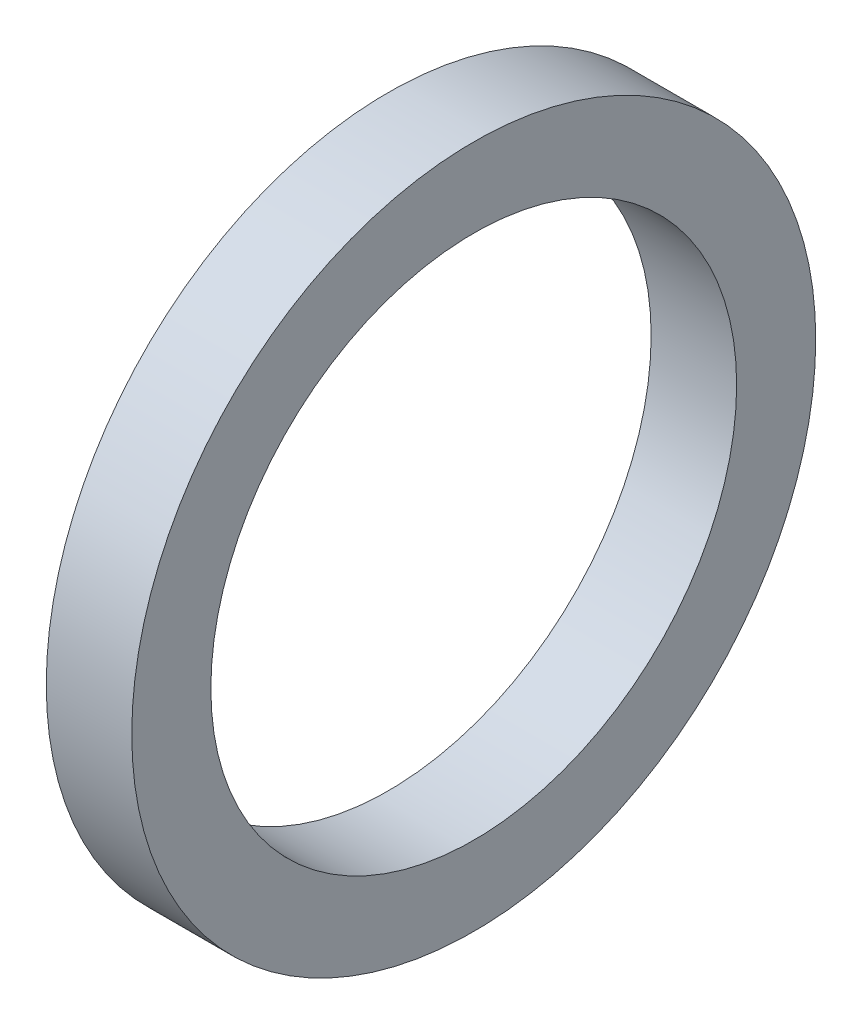
ISO-10303-21;
HEADER;
FILE_DESCRIPTION(('STEP AP214'),'2;1');
FILE_NAME('part.step','',(''),(''),'','','');
FILE_SCHEMA(('AUTOMOTIVE_DESIGN { 1 0 10303 214 1 1 1 1 }'));
ENDSEC;
DATA;
#1=APPLICATION_CONTEXT('core data for automotive mechanical design processes');
#2=APPLICATION_PROTOCOL_DEFINITION('international standard','automotive_design',2000,#1);
#3=PRODUCT_CONTEXT('',#1,'mechanical');
#4=PRODUCT('Part','Part','',(#3));
#5=PRODUCT_RELATED_PRODUCT_CATEGORY('part','',(#4));
#6=PRODUCT_DEFINITION_FORMATION('','',#4);
#7=PRODUCT_DEFINITION_CONTEXT('part definition',#1,'design');
#8=PRODUCT_DEFINITION('design','',#6,#7);
#9=PRODUCT_DEFINITION_SHAPE('','',#8);
#10=(LENGTH_UNIT() NAMED_UNIT(*) SI_UNIT(.MILLI.,.METRE.));
#11=(NAMED_UNIT(*) PLANE_ANGLE_UNIT() SI_UNIT($,.RADIAN.));
#12=(NAMED_UNIT(*) SI_UNIT($,.STERADIAN.) SOLID_ANGLE_UNIT());
#13=UNCERTAINTY_MEASURE_WITH_UNIT(LENGTH_MEASURE(1.E-05),#10,'distance_accuracy_value','');
#14=(GEOMETRIC_REPRESENTATION_CONTEXT(3) GLOBAL_UNCERTAINTY_ASSIGNED_CONTEXT((#13)) GLOBAL_UNIT_ASSIGNED_CONTEXT((#10,
#11,#12)) REPRESENTATION_CONTEXT('',''));
#15=CARTESIAN_POINT('',(0.,0.,0.));
#16=DIRECTION('',(0.,0.,1.));
#17=DIRECTION('',(1.,0.,0.));
#18=AXIS2_PLACEMENT_3D('',#15,#16,#17);
#19=CARTESIAN_POINT('',(2.,0.,0.));
#20=DIRECTION('',(1.,0.,0.));
#21=DIRECTION('',(0.,0.,-1.));
#22=AXIS2_PLACEMENT_3D('',#19,#20,#21);
#23=PLANE('',#22);
#24=CARTESIAN_POINT('',(2.,0.,0.));
#25=DIRECTION('',(1.,0.,0.));
#26=DIRECTION('',(0.,0.,-1.));
#27=AXIS2_PLACEMENT_3D('',#24,#25,#26);
#28=CIRCLE('',#27,8.);
#29=CARTESIAN_POINT('',(2.,0.,-8.));
#30=VERTEX_POINT('',#29);
#31=EDGE_CURVE('E10',#30,#30,#28,.T.);
#32=ORIENTED_EDGE('',*,*,#31,.T.);
#33=EDGE_LOOP('',(#32));
#34=FACE_BOUND('',#33,.T.);
#35=CARTESIAN_POINT('',(2.,0.,0.));
#36=DIRECTION('',(1.,0.,0.));
#37=DIRECTION('',(0.,0.,-1.));
#38=AXIS2_PLACEMENT_3D('',#35,#36,#37);
#39=CIRCLE('',#38,6.15);
#40=CARTESIAN_POINT('',(2.,0.,-6.15));
#41=VERTEX_POINT('',#40);
#42=EDGE_CURVE('E42',#41,#41,#39,.T.);
#43=ORIENTED_EDGE('',*,*,#42,.F.);
#44=EDGE_LOOP('',(#43));
#45=FACE_BOUND('',#44,.T.);
#46=ADVANCED_FACE('F31',(#34,#45),#23,.T.);
#47=CARTESIAN_POINT('',(0.,0.,0.));
#48=DIRECTION('',(1.,0.,0.));
#49=DIRECTION('',(0.,0.,-1.));
#50=AXIS2_PLACEMENT_3D('',#47,#48,#49);
#51=PLANE('',#50);
#52=CARTESIAN_POINT('',(0.,0.,0.));
#53=DIRECTION('',(1.,0.,0.));
#54=DIRECTION('',(0.,0.,-1.));
#55=AXIS2_PLACEMENT_3D('',#52,#53,#54);
#56=CIRCLE('',#55,8.);
#57=CARTESIAN_POINT('',(0.,0.,-8.));
#58=VERTEX_POINT('',#57);
#59=EDGE_CURVE('E35',#58,#58,#56,.T.);
#60=ORIENTED_EDGE('',*,*,#59,.F.);
#61=EDGE_LOOP('',(#60));
#62=FACE_BOUND('',#61,.T.);
#63=CARTESIAN_POINT('',(0.,0.,0.));
#64=DIRECTION('',(1.,0.,0.));
#65=DIRECTION('',(0.,0.,-1.));
#66=AXIS2_PLACEMENT_3D('',#63,#64,#65);
#67=CIRCLE('',#66,6.15);
#68=CARTESIAN_POINT('',(0.,0.,-6.15));
#69=VERTEX_POINT('',#68);
#70=EDGE_CURVE('E44',#69,#69,#67,.T.);
#71=ORIENTED_EDGE('',*,*,#70,.T.);
#72=EDGE_LOOP('',(#71));
#73=FACE_BOUND('',#72,.T.);
#74=ADVANCED_FACE('F54',(#62,#73),#51,.F.);
#75=CARTESIAN_POINT('',(2.,0.,0.));
#76=DIRECTION('',(-1.,0.,0.));
#77=DIRECTION('',(0.,0.,1.));
#78=AXIS2_PLACEMENT_3D('',#75,#76,#77);
#79=CYLINDRICAL_SURFACE('',#78,8.);
#80=ORIENTED_EDGE('',*,*,#31,.F.);
#81=EDGE_LOOP('',(#80));
#82=FACE_BOUND('',#81,.T.);
#83=ORIENTED_EDGE('',*,*,#59,.T.);
#84=EDGE_LOOP('',(#83));
#85=FACE_BOUND('',#84,.T.);
#86=ADVANCED_FACE('F33',(#82,#85),#79,.T.);
#87=CARTESIAN_POINT('',(2.,0.,0.));
#88=DIRECTION('',(-1.,0.,0.));
#89=DIRECTION('',(0.,0.,1.));
#90=AXIS2_PLACEMENT_3D('',#87,#88,#89);
#91=CYLINDRICAL_SURFACE('',#90,6.15);
#92=ORIENTED_EDGE('',*,*,#42,.T.);
#93=EDGE_LOOP('',(#92));
#94=FACE_BOUND('',#93,.T.);
#95=ORIENTED_EDGE('',*,*,#70,.F.);
#96=EDGE_LOOP('',(#95));
#97=FACE_BOUND('',#96,.T.);
#98=ADVANCED_FACE('F50',(#94,#97),#91,.F.);
#99=CLOSED_SHELL('',(#46,#74,#86,#98));
#100=MANIFOLD_SOLID_BREP('B2',#99);
#101=ADVANCED_BREP_SHAPE_REPRESENTATION('',(#18,#100),#14);
#102=SHAPE_DEFINITION_REPRESENTATION(#9,#101);
ENDSEC;
END-ISO-10303-21;
